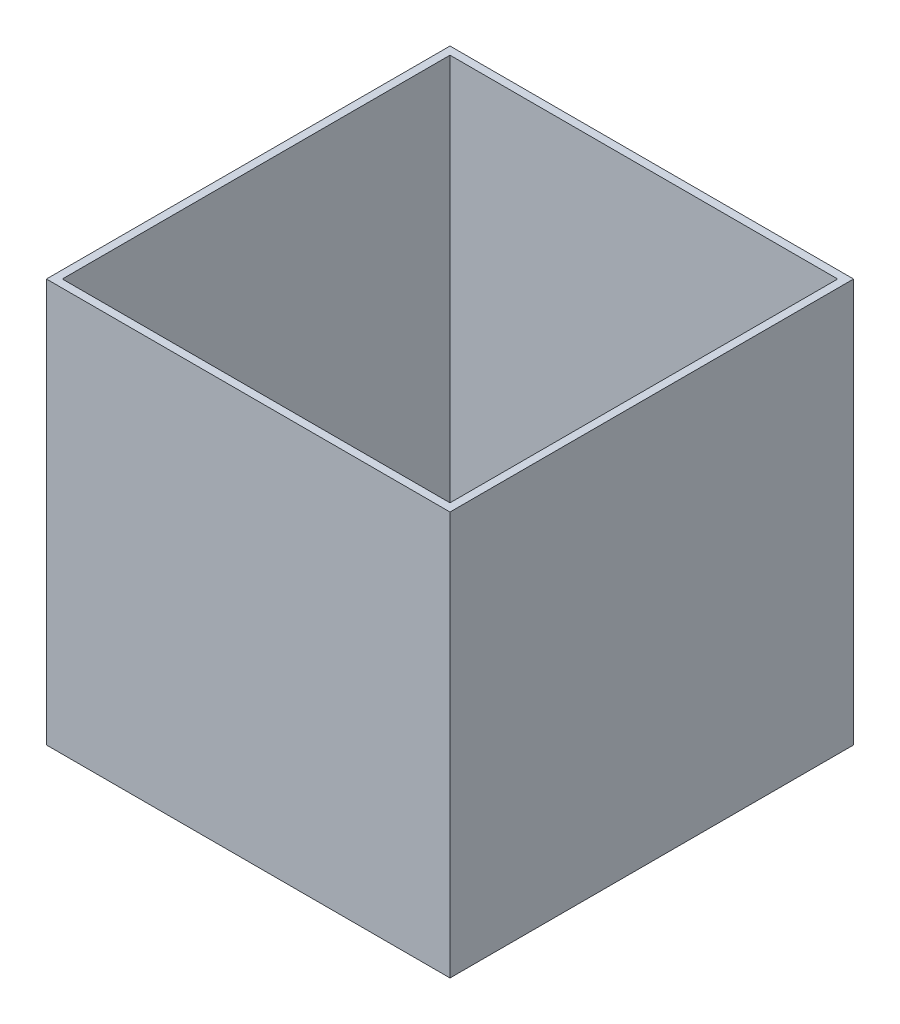
ISO-10303-21;
HEADER;
FILE_DESCRIPTION(('STEP AP214'),'2;1');
FILE_NAME('part.step','',(''),(''),'','','');
FILE_SCHEMA(('AUTOMOTIVE_DESIGN { 1 0 10303 214 1 1 1 1 }'));
ENDSEC;
DATA;
#1=APPLICATION_CONTEXT('core data for automotive mechanical design processes');
#2=APPLICATION_PROTOCOL_DEFINITION('international standard','automotive_design',2000,#1);
#3=PRODUCT_CONTEXT('',#1,'mechanical');
#4=PRODUCT('Part','Part','',(#3));
#5=PRODUCT_RELATED_PRODUCT_CATEGORY('part','',(#4));
#6=PRODUCT_DEFINITION_FORMATION('','',#4);
#7=PRODUCT_DEFINITION_CONTEXT('part definition',#1,'design');
#8=PRODUCT_DEFINITION('design','',#6,#7);
#9=PRODUCT_DEFINITION_SHAPE('','',#8);
#10=(LENGTH_UNIT() NAMED_UNIT(*) SI_UNIT(.MILLI.,.METRE.));
#11=(NAMED_UNIT(*) PLANE_ANGLE_UNIT() SI_UNIT($,.RADIAN.));
#12=(NAMED_UNIT(*) SI_UNIT($,.STERADIAN.) SOLID_ANGLE_UNIT());
#13=UNCERTAINTY_MEASURE_WITH_UNIT(LENGTH_MEASURE(1.E-05),#10,'distance_accuracy_value','');
#14=(GEOMETRIC_REPRESENTATION_CONTEXT(3) GLOBAL_UNCERTAINTY_ASSIGNED_CONTEXT((#13)) GLOBAL_UNIT_ASSIGNED_CONTEXT((#10,
#11,#12)) REPRESENTATION_CONTEXT('',''));
#15=CARTESIAN_POINT('',(0.,0.,0.));
#16=DIRECTION('',(0.,0.,1.));
#17=DIRECTION('',(1.,0.,0.));
#18=AXIS2_PLACEMENT_3D('',#15,#16,#17);
#19=CARTESIAN_POINT('',(50.8,101.6,-50.8));
#20=DIRECTION('',(0.,0.,1.));
#21=DIRECTION('',(1.,0.,0.));
#22=AXIS2_PLACEMENT_3D('',#19,#20,#21);
#23=PLANE('',#22);
#24=DIRECTION('',(-1.,0.,0.));
#25=VECTOR('',#24,1.);
#26=CARTESIAN_POINT('',(50.8,0.,-50.8));
#27=LINE('',#26,#25);
#28=CARTESIAN_POINT('',(50.8,0.,-50.8));
#29=VERTEX_POINT('',#28);
#30=CARTESIAN_POINT('',(-50.8,0.,-50.8));
#31=VERTEX_POINT('',#30);
#32=EDGE_CURVE('E145',#29,#31,#27,.T.);
#33=ORIENTED_EDGE('',*,*,#32,.T.);
#34=DIRECTION('',(0.,-1.,0.));
#35=VECTOR('',#34,1.);
#36=CARTESIAN_POINT('',(-50.8,101.6,-50.8));
#37=LINE('',#36,#35);
#38=CARTESIAN_POINT('',(-50.8,101.6,-50.8));
#39=VERTEX_POINT('',#38);
#40=EDGE_CURVE('E11',#39,#31,#37,.T.);
#41=ORIENTED_EDGE('',*,*,#40,.F.);
#42=DIRECTION('',(-1.,0.,0.));
#43=VECTOR('',#42,1.);
#44=CARTESIAN_POINT('',(50.8,101.6,-50.8));
#45=LINE('',#44,#43);
#46=CARTESIAN_POINT('',(50.8,101.6,-50.8));
#47=VERTEX_POINT('',#46);
#48=EDGE_CURVE('E149',#47,#39,#45,.T.);
#49=ORIENTED_EDGE('',*,*,#48,.F.);
#50=DIRECTION('',(0.,-1.,0.));
#51=VECTOR('',#50,1.);
#52=CARTESIAN_POINT('',(50.8,101.6,-50.8));
#53=LINE('',#52,#51);
#54=EDGE_CURVE('E155',#47,#29,#53,.T.);
#55=ORIENTED_EDGE('',*,*,#54,.T.);
#56=EDGE_LOOP('',(#33,#41,#49,#55));
#57=FACE_BOUND('',#56,.T.);
#58=ADVANCED_FACE('F37',(#57),#23,.F.);
#59=CARTESIAN_POINT('',(-50.8,101.6,-50.8));
#60=DIRECTION('',(1.,0.,0.));
#61=DIRECTION('',(0.,0.,-1.));
#62=AXIS2_PLACEMENT_3D('',#59,#60,#61);
#63=PLANE('',#62);
#64=DIRECTION('',(0.,0.,1.));
#65=VECTOR('',#64,1.);
#66=CARTESIAN_POINT('',(-50.8,0.,-50.8));
#67=LINE('',#66,#65);
#68=CARTESIAN_POINT('',(-50.8,0.,50.8));
#69=VERTEX_POINT('',#68);
#70=EDGE_CURVE('E158',#31,#69,#67,.T.);
#71=ORIENTED_EDGE('',*,*,#70,.T.);
#72=DIRECTION('',(0.,-1.,0.));
#73=VECTOR('',#72,1.);
#74=CARTESIAN_POINT('',(-50.8,101.6,50.8));
#75=LINE('',#74,#73);
#76=CARTESIAN_POINT('',(-50.8,101.6,50.8));
#77=VERTEX_POINT('',#76);
#78=EDGE_CURVE('E44',#77,#69,#75,.T.);
#79=ORIENTED_EDGE('',*,*,#78,.F.);
#80=DIRECTION('',(0.,0.,1.));
#81=VECTOR('',#80,1.);
#82=CARTESIAN_POINT('',(-50.8,101.6,-50.8));
#83=LINE('',#82,#81);
#84=EDGE_CURVE('E88',#39,#77,#83,.T.);
#85=ORIENTED_EDGE('',*,*,#84,.F.);
#86=ORIENTED_EDGE('',*,*,#40,.T.);
#87=EDGE_LOOP('',(#71,#79,#85,#86));
#88=FACE_BOUND('',#87,.T.);
#89=ADVANCED_FACE('F187',(#88),#63,.F.);
#90=CARTESIAN_POINT('',(-50.8,101.6,50.8));
#91=DIRECTION('',(0.,0.,-1.));
#92=DIRECTION('',(-1.,0.,0.));
#93=AXIS2_PLACEMENT_3D('',#90,#91,#92);
#94=PLANE('',#93);
#95=DIRECTION('',(1.,0.,0.));
#96=VECTOR('',#95,1.);
#97=CARTESIAN_POINT('',(-50.8,0.,50.8));
#98=LINE('',#97,#96);
#99=CARTESIAN_POINT('',(50.8,0.,50.8));
#100=VERTEX_POINT('',#99);
#101=EDGE_CURVE('E160',#69,#100,#98,.T.);
#102=ORIENTED_EDGE('',*,*,#101,.T.);
#103=DIRECTION('',(0.,-1.,0.));
#104=VECTOR('',#103,1.);
#105=CARTESIAN_POINT('',(50.8,101.6,50.8));
#106=LINE('',#105,#104);
#107=CARTESIAN_POINT('',(50.8,101.6,50.8));
#108=VERTEX_POINT('',#107);
#109=EDGE_CURVE('E164',#108,#100,#106,.T.);
#110=ORIENTED_EDGE('',*,*,#109,.F.);
#111=DIRECTION('',(1.,0.,0.));
#112=VECTOR('',#111,1.);
#113=CARTESIAN_POINT('',(-50.8,101.6,50.8));
#114=LINE('',#113,#112);
#115=EDGE_CURVE('E152',#77,#108,#114,.T.);
#116=ORIENTED_EDGE('',*,*,#115,.F.);
#117=ORIENTED_EDGE('',*,*,#78,.T.);
#118=EDGE_LOOP('',(#102,#110,#116,#117));
#119=FACE_BOUND('',#118,.T.);
#120=ADVANCED_FACE('F169',(#119),#94,.F.);
#121=CARTESIAN_POINT('',(50.8,101.6,50.8));
#122=DIRECTION('',(-1.,0.,0.));
#123=DIRECTION('',(0.,0.,1.));
#124=AXIS2_PLACEMENT_3D('',#121,#122,#123);
#125=PLANE('',#124);
#126=DIRECTION('',(0.,0.,-1.));
#127=VECTOR('',#126,1.);
#128=CARTESIAN_POINT('',(50.8,0.,50.8));
#129=LINE('',#128,#127);
#130=EDGE_CURVE('E81',#100,#29,#129,.T.);
#131=ORIENTED_EDGE('',*,*,#130,.T.);
#132=ORIENTED_EDGE('',*,*,#54,.F.);
#133=DIRECTION('',(0.,0.,-1.));
#134=VECTOR('',#133,1.);
#135=CARTESIAN_POINT('',(50.8,101.6,50.8));
#136=LINE('',#135,#134);
#137=EDGE_CURVE('E60',#108,#47,#136,.T.);
#138=ORIENTED_EDGE('',*,*,#137,.F.);
#139=ORIENTED_EDGE('',*,*,#109,.T.);
#140=EDGE_LOOP('',(#131,#132,#138,#139));
#141=FACE_BOUND('',#140,.T.);
#142=ADVANCED_FACE('F177',(#141),#125,.F.);
#143=CARTESIAN_POINT('',(0.,101.6,0.));
#144=DIRECTION('',(0.,1.,0.));
#145=DIRECTION('',(0.,0.,1.));
#146=AXIS2_PLACEMENT_3D('',#143,#144,#145);
#147=PLANE('',#146);
#148=DIRECTION('',(0.,0.,-1.));
#149=VECTOR('',#148,1.);
#150=CARTESIAN_POINT('',(48.8,101.6,48.8));
#151=LINE('',#150,#149);
#152=CARTESIAN_POINT('',(48.8,101.6,48.8));
#153=VERTEX_POINT('',#152);
#154=CARTESIAN_POINT('',(48.8,101.6,-48.8));
#155=VERTEX_POINT('',#154);
#156=EDGE_CURVE('E51',#153,#155,#151,.T.);
#157=ORIENTED_EDGE('',*,*,#156,.F.);
#158=DIRECTION('',(1.,0.,0.));
#159=VECTOR('',#158,1.);
#160=CARTESIAN_POINT('',(-48.8,101.6,48.8));
#161=LINE('',#160,#159);
#162=CARTESIAN_POINT('',(-48.8,101.6,48.8));
#163=VERTEX_POINT('',#162);
#164=EDGE_CURVE('E130',#163,#153,#161,.T.);
#165=ORIENTED_EDGE('',*,*,#164,.F.);
#166=DIRECTION('',(0.,0.,1.));
#167=VECTOR('',#166,1.);
#168=CARTESIAN_POINT('',(-48.8,101.6,-48.8));
#169=LINE('',#168,#167);
#170=CARTESIAN_POINT('',(-48.8,101.6,-48.8));
#171=VERTEX_POINT('',#170);
#172=EDGE_CURVE('E133',#171,#163,#169,.T.);
#173=ORIENTED_EDGE('',*,*,#172,.F.);
#174=DIRECTION('',(-1.,0.,0.));
#175=VECTOR('',#174,1.);
#176=CARTESIAN_POINT('',(48.8,101.6,-48.8));
#177=LINE('',#176,#175);
#178=EDGE_CURVE('E139',#155,#171,#177,.T.);
#179=ORIENTED_EDGE('',*,*,#178,.F.);
#180=EDGE_LOOP('',(#157,#165,#173,#179));
#181=FACE_BOUND('',#180,.T.);
#182=ORIENTED_EDGE('',*,*,#48,.T.);
#183=ORIENTED_EDGE('',*,*,#84,.T.);
#184=ORIENTED_EDGE('',*,*,#115,.T.);
#185=ORIENTED_EDGE('',*,*,#137,.T.);
#186=EDGE_LOOP('',(#182,#183,#184,#185));
#187=FACE_BOUND('',#186,.T.);
#188=ADVANCED_FACE('F179',(#181,#187),#147,.T.);
#189=CARTESIAN_POINT('',(0.,0.,0.));
#190=DIRECTION('',(0.,1.,0.));
#191=DIRECTION('',(0.,0.,1.));
#192=AXIS2_PLACEMENT_3D('',#189,#190,#191);
#193=PLANE('',#192);
#194=ORIENTED_EDGE('',*,*,#32,.F.);
#195=ORIENTED_EDGE('',*,*,#130,.F.);
#196=ORIENTED_EDGE('',*,*,#101,.F.);
#197=ORIENTED_EDGE('',*,*,#70,.F.);
#198=EDGE_LOOP('',(#194,#195,#196,#197));
#199=FACE_BOUND('',#198,.T.);
#200=ADVANCED_FACE('F173',(#199),#193,.F.);
#201=CARTESIAN_POINT('',(48.8,2.,48.8));
#202=DIRECTION('',(1.,0.,0.));
#203=DIRECTION('',(0.,0.,-1.));
#204=AXIS2_PLACEMENT_3D('',#201,#202,#203);
#205=PLANE('',#204);
#206=ORIENTED_EDGE('',*,*,#156,.T.);
#207=DIRECTION('',(0.,1.,0.));
#208=VECTOR('',#207,1.);
#209=CARTESIAN_POINT('',(48.8,2.,-48.8));
#210=LINE('',#209,#208);
#211=CARTESIAN_POINT('',(48.8,2.,-48.8));
#212=VERTEX_POINT('',#211);
#213=EDGE_CURVE('E108',#212,#155,#210,.T.);
#214=ORIENTED_EDGE('',*,*,#213,.F.);
#215=DIRECTION('',(0.,0.,-1.));
#216=VECTOR('',#215,1.);
#217=CARTESIAN_POINT('',(48.8,2.,48.8));
#218=LINE('',#217,#216);
#219=CARTESIAN_POINT('',(48.8,2.,48.8));
#220=VERTEX_POINT('',#219);
#221=EDGE_CURVE('E112',#220,#212,#218,.T.);
#222=ORIENTED_EDGE('',*,*,#221,.F.);
#223=DIRECTION('',(0.,1.,0.));
#224=VECTOR('',#223,1.);
#225=CARTESIAN_POINT('',(48.8,2.,48.8));
#226=LINE('',#225,#224);
#227=EDGE_CURVE('E143',#220,#153,#226,.T.);
#228=ORIENTED_EDGE('',*,*,#227,.T.);
#229=EDGE_LOOP('',(#206,#214,#222,#228));
#230=FACE_BOUND('',#229,.T.);
#231=ADVANCED_FACE('F110',(#230),#205,.F.);
#232=CARTESIAN_POINT('',(-48.8,2.,48.8));
#233=DIRECTION('',(0.,0.,1.));
#234=DIRECTION('',(1.,0.,0.));
#235=AXIS2_PLACEMENT_3D('',#232,#233,#234);
#236=PLANE('',#235);
#237=ORIENTED_EDGE('',*,*,#164,.T.);
#238=ORIENTED_EDGE('',*,*,#227,.F.);
#239=DIRECTION('',(1.,0.,0.));
#240=VECTOR('',#239,1.);
#241=CARTESIAN_POINT('',(-48.8,2.,48.8));
#242=LINE('',#241,#240);
#243=CARTESIAN_POINT('',(-48.8,2.,48.8));
#244=VERTEX_POINT('',#243);
#245=EDGE_CURVE('E118',#244,#220,#242,.T.);
#246=ORIENTED_EDGE('',*,*,#245,.F.);
#247=DIRECTION('',(0.,1.,0.));
#248=VECTOR('',#247,1.);
#249=CARTESIAN_POINT('',(-48.8,2.,48.8));
#250=LINE('',#249,#248);
#251=EDGE_CURVE('E146',#244,#163,#250,.T.);
#252=ORIENTED_EDGE('',*,*,#251,.T.);
#253=EDGE_LOOP('',(#237,#238,#246,#252));
#254=FACE_BOUND('',#253,.T.);
#255=ADVANCED_FACE('F226',(#254),#236,.F.);
#256=CARTESIAN_POINT('',(-48.8,2.,-48.8));
#257=DIRECTION('',(-1.,0.,0.));
#258=DIRECTION('',(0.,0.,1.));
#259=AXIS2_PLACEMENT_3D('',#256,#257,#258);
#260=PLANE('',#259);
#261=ORIENTED_EDGE('',*,*,#172,.T.);
#262=ORIENTED_EDGE('',*,*,#251,.F.);
#263=DIRECTION('',(0.,0.,1.));
#264=VECTOR('',#263,1.);
#265=CARTESIAN_POINT('',(-48.8,2.,-48.8));
#266=LINE('',#265,#264);
#267=CARTESIAN_POINT('',(-48.8,2.,-48.8));
#268=VERTEX_POINT('',#267);
#269=EDGE_CURVE('E126',#268,#244,#266,.T.);
#270=ORIENTED_EDGE('',*,*,#269,.F.);
#271=DIRECTION('',(0.,1.,0.));
#272=VECTOR('',#271,1.);
#273=CARTESIAN_POINT('',(-48.8,2.,-48.8));
#274=LINE('',#273,#272);
#275=EDGE_CURVE('E117',#268,#171,#274,.T.);
#276=ORIENTED_EDGE('',*,*,#275,.T.);
#277=EDGE_LOOP('',(#261,#262,#270,#276));
#278=FACE_BOUND('',#277,.T.);
#279=ADVANCED_FACE('F235',(#278),#260,.F.);
#280=CARTESIAN_POINT('',(48.8,2.,-48.8));
#281=DIRECTION('',(0.,0.,-1.));
#282=DIRECTION('',(-1.,0.,0.));
#283=AXIS2_PLACEMENT_3D('',#280,#281,#282);
#284=PLANE('',#283);
#285=ORIENTED_EDGE('',*,*,#178,.T.);
#286=ORIENTED_EDGE('',*,*,#275,.F.);
#287=DIRECTION('',(-1.,0.,0.));
#288=VECTOR('',#287,1.);
#289=CARTESIAN_POINT('',(48.8,2.,-48.8));
#290=LINE('',#289,#288);
#291=EDGE_CURVE('E121',#212,#268,#290,.T.);
#292=ORIENTED_EDGE('',*,*,#291,.F.);
#293=ORIENTED_EDGE('',*,*,#213,.T.);
#294=EDGE_LOOP('',(#285,#286,#292,#293));
#295=FACE_BOUND('',#294,.T.);
#296=ADVANCED_FACE('F122',(#295),#284,.F.);
#297=CARTESIAN_POINT('',(0.,2.,0.));
#298=DIRECTION('',(0.,1.,0.));
#299=DIRECTION('',(0.,0.,1.));
#300=AXIS2_PLACEMENT_3D('',#297,#298,#299);
#301=PLANE('',#300);
#302=ORIENTED_EDGE('',*,*,#221,.T.);
#303=ORIENTED_EDGE('',*,*,#291,.T.);
#304=ORIENTED_EDGE('',*,*,#269,.T.);
#305=ORIENTED_EDGE('',*,*,#245,.T.);
#306=EDGE_LOOP('',(#302,#303,#304,#305));
#307=FACE_BOUND('',#306,.T.);
#308=ADVANCED_FACE('F128',(#307),#301,.T.);
#309=CLOSED_SHELL('',(#58,#89,#120,#142,#188,#200,#231,#255,#279,#296,#308));
#310=MANIFOLD_SOLID_BREP('B2',#309);
#311=ADVANCED_BREP_SHAPE_REPRESENTATION('',(#18,#310),#14);
#312=SHAPE_DEFINITION_REPRESENTATION(#9,#311);
ENDSEC;
END-ISO-10303-21;
